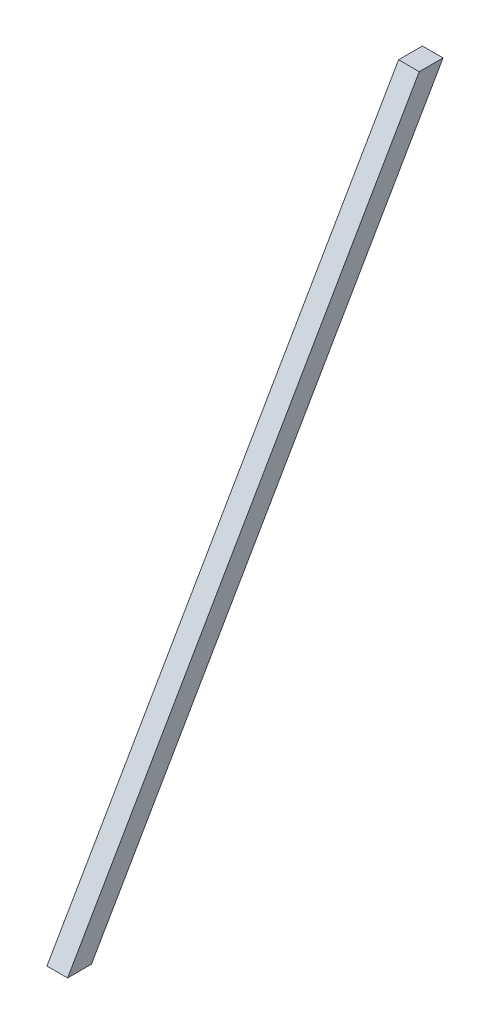
ISO-10303-21;
HEADER;
FILE_DESCRIPTION(('STEP AP214'),'2;1');
FILE_NAME('part.step','',(''),(''),'','','');
FILE_SCHEMA(('AUTOMOTIVE_DESIGN { 1 0 10303 214 1 1 1 1 }'));
ENDSEC;
DATA;
#1=APPLICATION_CONTEXT('core data for automotive mechanical design processes');
#2=APPLICATION_PROTOCOL_DEFINITION('international standard','automotive_design',2000,#1);
#3=PRODUCT_CONTEXT('',#1,'mechanical');
#4=PRODUCT('Part','Part','',(#3));
#5=PRODUCT_RELATED_PRODUCT_CATEGORY('part','',(#4));
#6=PRODUCT_DEFINITION_FORMATION('','',#4);
#7=PRODUCT_DEFINITION_CONTEXT('part definition',#1,'design');
#8=PRODUCT_DEFINITION('design','',#6,#7);
#9=PRODUCT_DEFINITION_SHAPE('','',#8);
#10=(LENGTH_UNIT() NAMED_UNIT(*) SI_UNIT(.MILLI.,.METRE.));
#11=(NAMED_UNIT(*) PLANE_ANGLE_UNIT() SI_UNIT($,.RADIAN.));
#12=(NAMED_UNIT(*) SI_UNIT($,.STERADIAN.) SOLID_ANGLE_UNIT());
#13=UNCERTAINTY_MEASURE_WITH_UNIT(LENGTH_MEASURE(1.E-05),#10,'distance_accuracy_value','');
#14=(GEOMETRIC_REPRESENTATION_CONTEXT(3) GLOBAL_UNCERTAINTY_ASSIGNED_CONTEXT((#13)) GLOBAL_UNIT_ASSIGNED_CONTEXT((#10,
#11,#12)) REPRESENTATION_CONTEXT('',''));
#15=CARTESIAN_POINT('',(0.,0.,0.));
#16=DIRECTION('',(0.,0.,1.));
#17=DIRECTION('',(1.,0.,0.));
#18=AXIS2_PLACEMENT_3D('',#15,#16,#17);
#19=CARTESIAN_POINT('',(25.4,749.3,-432.608556703791));
#20=DIRECTION('',(0.,0.500000000000004,0.866025403784436));
#21=DIRECTION('',(0.,-0.866025403784436,0.500000000000004));
#22=AXIS2_PLACEMENT_3D('',#19,#20,#21);
#23=PLANE('',#22);
#24=DIRECTION('',(0.,0.866025403784436,-0.500000000000004));
#25=VECTOR('',#24,1.);
#26=CARTESIAN_POINT('',(0.,749.3,-432.608556703791));
#27=LINE('',#26,#25);
#28=CARTESIAN_POINT('',(0.,0.,0.));
#29=VERTEX_POINT('',#28);
#30=CARTESIAN_POINT('',(0.,749.3,-432.608556703791));
#31=VERTEX_POINT('',#30);
#32=EDGE_CURVE('E96',#29,#31,#27,.T.);
#33=ORIENTED_EDGE('',*,*,#32,.T.);
#34=DIRECTION('',(-1.,0.,0.));
#35=VECTOR('',#34,1.);
#36=CARTESIAN_POINT('',(25.4,749.3,-432.608556703791));
#37=LINE('',#36,#35);
#38=CARTESIAN_POINT('',(25.4,749.3,-432.608556703791));
#39=VERTEX_POINT('',#38);
#40=EDGE_CURVE('E11',#39,#31,#37,.T.);
#41=ORIENTED_EDGE('',*,*,#40,.F.);
#42=DIRECTION('',(0.,0.866025403784436,-0.500000000000004));
#43=VECTOR('',#42,1.);
#44=CARTESIAN_POINT('',(25.4,749.3,-432.608556703791));
#45=LINE('',#44,#43);
#46=CARTESIAN_POINT('',(25.4,0.,0.));
#47=VERTEX_POINT('',#46);
#48=EDGE_CURVE('E84',#47,#39,#45,.T.);
#49=ORIENTED_EDGE('',*,*,#48,.F.);
#50=DIRECTION('',(-1.,0.,0.));
#51=VECTOR('',#50,1.);
#52=CARTESIAN_POINT('',(25.4,0.,0.));
#53=LINE('',#52,#51);
#54=EDGE_CURVE('E92',#47,#29,#53,.T.);
#55=ORIENTED_EDGE('',*,*,#54,.T.);
#56=EDGE_LOOP('',(#33,#41,#49,#55));
#57=FACE_BOUND('',#56,.T.);
#58=ADVANCED_FACE('F33',(#57),#23,.F.);
#59=CARTESIAN_POINT('',(25.4,749.3,-403.279163028958));
#60=DIRECTION('',(0.,-1.,0.));
#61=DIRECTION('',(0.,0.,-1.));
#62=AXIS2_PLACEMENT_3D('',#59,#60,#61);
#63=PLANE('',#62);
#64=DIRECTION('',(0.,0.,1.));
#65=VECTOR('',#64,1.);
#66=CARTESIAN_POINT('',(0.,749.3,-403.279163028958));
#67=LINE('',#66,#65);
#68=CARTESIAN_POINT('',(0.,749.3,-403.279163028958));
#69=VERTEX_POINT('',#68);
#70=EDGE_CURVE('E88',#31,#69,#67,.T.);
#71=ORIENTED_EDGE('',*,*,#70,.T.);
#72=DIRECTION('',(-1.,0.,0.));
#73=VECTOR('',#72,1.);
#74=CARTESIAN_POINT('',(25.4,749.3,-403.279163028958));
#75=LINE('',#74,#73);
#76=CARTESIAN_POINT('',(25.4,749.3,-403.279163028958));
#77=VERTEX_POINT('',#76);
#78=EDGE_CURVE('E41',#77,#69,#75,.T.);
#79=ORIENTED_EDGE('',*,*,#78,.F.);
#80=DIRECTION('',(0.,0.,1.));
#81=VECTOR('',#80,1.);
#82=CARTESIAN_POINT('',(25.4,749.3,-403.279163028958));
#83=LINE('',#82,#81);
#84=EDGE_CURVE('E79',#39,#77,#83,.T.);
#85=ORIENTED_EDGE('',*,*,#84,.F.);
#86=ORIENTED_EDGE('',*,*,#40,.T.);
#87=EDGE_LOOP('',(#71,#79,#85,#86));
#88=FACE_BOUND('',#87,.T.);
#89=ADVANCED_FACE('F87',(#88),#63,.F.);
#90=CARTESIAN_POINT('',(25.4,0.,29.3293936748331));
#91=DIRECTION('',(0.,-0.500000000000004,-0.866025403784436));
#92=DIRECTION('',(0.,0.866025403784437,-0.500000000000004));
#93=AXIS2_PLACEMENT_3D('',#90,#91,#92);
#94=PLANE('',#93);
#95=DIRECTION('',(0.,-0.866025403784436,0.500000000000004));
#96=VECTOR('',#95,1.);
#97=CARTESIAN_POINT('',(0.,0.,29.3293936748331));
#98=LINE('',#97,#96);
#99=CARTESIAN_POINT('',(0.,0.,29.3293936748331));
#100=VERTEX_POINT('',#99);
#101=EDGE_CURVE('E66',#69,#100,#98,.T.);
#102=ORIENTED_EDGE('',*,*,#101,.T.);
#103=DIRECTION('',(-1.,0.,0.));
#104=VECTOR('',#103,1.);
#105=CARTESIAN_POINT('',(25.4,0.,29.3293936748331));
#106=LINE('',#105,#104);
#107=CARTESIAN_POINT('',(25.4,0.,29.3293936748331));
#108=VERTEX_POINT('',#107);
#109=EDGE_CURVE('E89',#108,#100,#106,.T.);
#110=ORIENTED_EDGE('',*,*,#109,.F.);
#111=DIRECTION('',(0.,-0.866025403784436,0.500000000000004));
#112=VECTOR('',#111,1.);
#113=CARTESIAN_POINT('',(25.4,0.,29.3293936748331));
#114=LINE('',#113,#112);
#115=EDGE_CURVE('E82',#77,#108,#114,.T.);
#116=ORIENTED_EDGE('',*,*,#115,.F.);
#117=ORIENTED_EDGE('',*,*,#78,.T.);
#118=EDGE_LOOP('',(#102,#110,#116,#117));
#119=FACE_BOUND('',#118,.T.);
#120=ADVANCED_FACE('F90',(#119),#94,.F.);
#121=CARTESIAN_POINT('',(25.4,0.,0.));
#122=DIRECTION('',(0.,1.,0.));
#123=DIRECTION('',(0.,0.,1.));
#124=AXIS2_PLACEMENT_3D('',#121,#122,#123);
#125=PLANE('',#124);
#126=DIRECTION('',(0.,0.,-1.));
#127=VECTOR('',#126,1.);
#128=CARTESIAN_POINT('',(0.,0.,0.));
#129=LINE('',#128,#127);
#130=EDGE_CURVE('E72',#100,#29,#129,.T.);
#131=ORIENTED_EDGE('',*,*,#130,.T.);
#132=ORIENTED_EDGE('',*,*,#54,.F.);
#133=DIRECTION('',(0.,0.,-1.));
#134=VECTOR('',#133,1.);
#135=CARTESIAN_POINT('',(25.4,0.,0.));
#136=LINE('',#135,#134);
#137=EDGE_CURVE('E49',#108,#47,#136,.T.);
#138=ORIENTED_EDGE('',*,*,#137,.F.);
#139=ORIENTED_EDGE('',*,*,#109,.T.);
#140=EDGE_LOOP('',(#131,#132,#138,#139));
#141=FACE_BOUND('',#140,.T.);
#142=ADVANCED_FACE('F103',(#141),#125,.F.);
#143=CARTESIAN_POINT('',(25.4,0.,0.));
#144=DIRECTION('',(-1.,0.,0.));
#145=DIRECTION('',(0.,0.,1.));
#146=AXIS2_PLACEMENT_3D('',#143,#144,#145);
#147=PLANE('',#146);
#148=ORIENTED_EDGE('',*,*,#48,.T.);
#149=ORIENTED_EDGE('',*,*,#84,.T.);
#150=ORIENTED_EDGE('',*,*,#115,.T.);
#151=ORIENTED_EDGE('',*,*,#137,.T.);
#152=EDGE_LOOP('',(#148,#149,#150,#151));
#153=FACE_BOUND('',#152,.T.);
#154=ADVANCED_FACE('F80',(#153),#147,.F.);
#155=CARTESIAN_POINT('',(0.,0.,0.));
#156=DIRECTION('',(-1.,0.,0.));
#157=DIRECTION('',(0.,0.,1.));
#158=AXIS2_PLACEMENT_3D('',#155,#156,#157);
#159=PLANE('',#158);
#160=ORIENTED_EDGE('',*,*,#32,.F.);
#161=ORIENTED_EDGE('',*,*,#130,.F.);
#162=ORIENTED_EDGE('',*,*,#101,.F.);
#163=ORIENTED_EDGE('',*,*,#70,.F.);
#164=EDGE_LOOP('',(#160,#161,#162,#163));
#165=FACE_BOUND('',#164,.T.);
#166=ADVANCED_FACE('F106',(#165),#159,.T.);
#167=CLOSED_SHELL('',(#58,#89,#120,#142,#154,#166));
#168=MANIFOLD_SOLID_BREP('B2',#167);
#169=ADVANCED_BREP_SHAPE_REPRESENTATION('',(#18,#168),#14);
#170=SHAPE_DEFINITION_REPRESENTATION(#9,#169);
ENDSEC;
END-ISO-10303-21;
